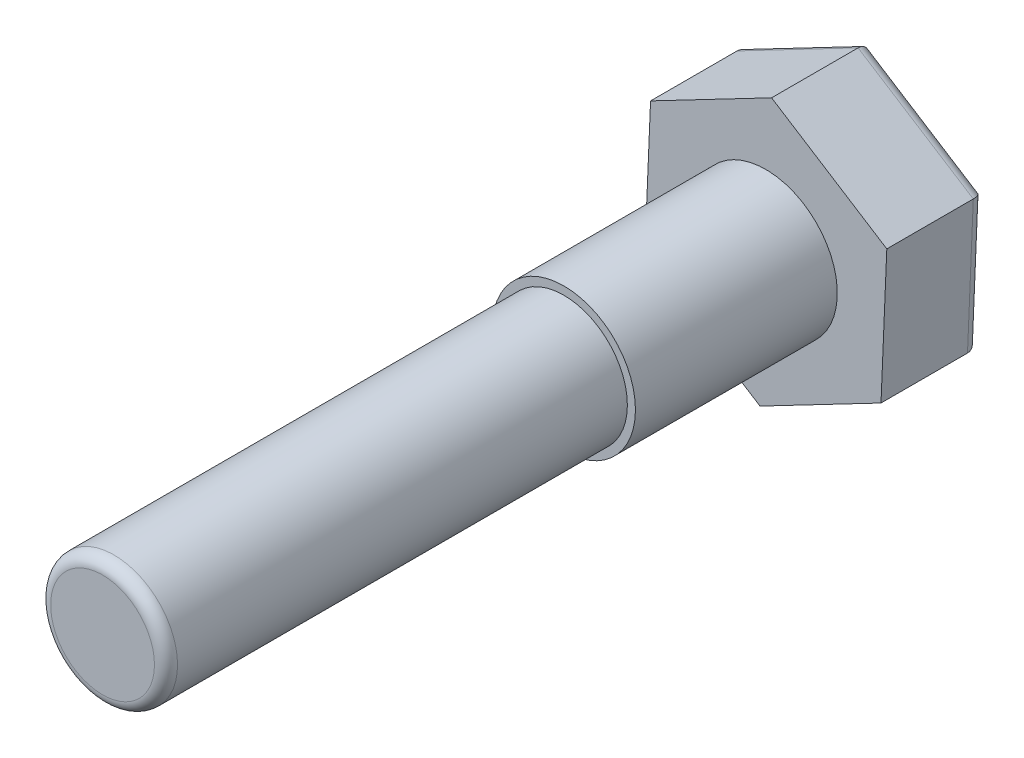
ISO-10303-21;
HEADER;
FILE_DESCRIPTION(('STEP AP214'),'2;1');
FILE_NAME('part.step','',(''),(''),'','','');
FILE_SCHEMA(('AUTOMOTIVE_DESIGN { 1 0 10303 214 1 1 1 1 }'));
ENDSEC;
DATA;
#1=APPLICATION_CONTEXT('core data for automotive mechanical design processes');
#2=APPLICATION_PROTOCOL_DEFINITION('international standard','automotive_design',2000,#1);
#3=PRODUCT_CONTEXT('',#1,'mechanical');
#4=PRODUCT('Part','Part','',(#3));
#5=PRODUCT_RELATED_PRODUCT_CATEGORY('part','',(#4));
#6=PRODUCT_DEFINITION_FORMATION('','',#4);
#7=PRODUCT_DEFINITION_CONTEXT('part definition',#1,'design');
#8=PRODUCT_DEFINITION('design','',#6,#7);
#9=PRODUCT_DEFINITION_SHAPE('','',#8);
#10=(LENGTH_UNIT() NAMED_UNIT(*) SI_UNIT(.MILLI.,.METRE.));
#11=(NAMED_UNIT(*) PLANE_ANGLE_UNIT() SI_UNIT($,.RADIAN.));
#12=(NAMED_UNIT(*) SI_UNIT($,.STERADIAN.) SOLID_ANGLE_UNIT());
#13=UNCERTAINTY_MEASURE_WITH_UNIT(LENGTH_MEASURE(1.E-05),#10,'distance_accuracy_value','');
#14=(GEOMETRIC_REPRESENTATION_CONTEXT(3) GLOBAL_UNCERTAINTY_ASSIGNED_CONTEXT((#13)) GLOBAL_UNIT_ASSIGNED_CONTEXT((#10,
#11,#12)) REPRESENTATION_CONTEXT('',''));
#15=CARTESIAN_POINT('',(0.,0.,0.));
#16=DIRECTION('',(0.,0.,1.));
#17=DIRECTION('',(1.,0.,0.));
#18=AXIS2_PLACEMENT_3D('',#15,#16,#17);
#19=CARTESIAN_POINT('',(0.,0.,52.));
#20=DIRECTION('',(0.,0.,1.));
#21=DIRECTION('',(1.,0.,0.));
#22=AXIS2_PLACEMENT_3D('',#19,#20,#21);
#23=PLANE('',#22);
#24=CARTESIAN_POINT('',(0.,0.,52.));
#25=DIRECTION('',(0.,0.,1.));
#26=DIRECTION('',(1.,0.,0.));
#27=AXIS2_PLACEMENT_3D('',#24,#25,#26);
#28=CIRCLE('',#27,12.4);
#29=CARTESIAN_POINT('',(12.4,0.,52.));
#30=VERTEX_POINT('',#29);
#31=EDGE_CURVE('E128',#30,#30,#28,.T.);
#32=ORIENTED_EDGE('',*,*,#31,.T.);
#33=EDGE_LOOP('',(#32));
#34=FACE_BOUND('',#33,.T.);
#35=CARTESIAN_POINT('',(0.,0.,52.));
#36=DIRECTION('',(0.,0.,1.));
#37=DIRECTION('',(1.,0.,0.));
#38=AXIS2_PLACEMENT_3D('',#35,#36,#37);
#39=CIRCLE('',#38,11.);
#40=CARTESIAN_POINT('',(11.,0.,52.));
#41=VERTEX_POINT('',#40);
#42=EDGE_CURVE('E166',#41,#41,#39,.T.);
#43=ORIENTED_EDGE('',*,*,#42,.F.);
#44=EDGE_LOOP('',(#43));
#45=FACE_BOUND('',#44,.T.);
#46=ADVANCED_FACE('F34',(#34,#45),#23,.T.);
#47=CARTESIAN_POINT('',(18.9733976863162,-36.3457037383633,17.));
#48=DIRECTION('',(0.,0.,-1.));
#49=DIRECTION('',(-1.,0.,0.));
#50=AXIS2_PLACEMENT_3D('',#47,#48,#49);
#51=PLANE('',#50);
#52=DIRECTION('',(0.0424733530909036,0.999097599975706,0.));
#53=VECTOR('',#52,1.);
#54=CARTESIAN_POINT('',(19.9787997617734,-12.6957037383635,17.));
#55=LINE('',#54,#53);
#56=CARTESIAN_POINT('',(19.9787997617734,-12.6957037383635,17.));
#57=VERTEX_POINT('',#56);
#58=CARTESIAN_POINT('',(20.9842018372306,10.9542962616365,17.));
#59=VERTEX_POINT('',#58);
#60=EDGE_CURVE('E120',#57,#59,#55,.T.);
#61=ORIENTED_EDGE('',*,*,#60,.T.);
#62=DIRECTION('',(-0.844007225893572,0.536331802748482,0.));
#63=VECTOR('',#62,1.);
#64=CARTESIAN_POINT('',(20.9842018372306,10.9542962616365,17.));
#65=LINE('',#64,#63);
#66=CARTESIAN_POINT('',(1.0054020754572,23.65,17.));
#67=VERTEX_POINT('',#66);
#68=EDGE_CURVE('E108',#59,#67,#65,.T.);
#69=ORIENTED_EDGE('',*,*,#68,.T.);
#70=DIRECTION('',(-0.886480578984472,-0.462765797227231,0.));
#71=VECTOR('',#70,1.);
#72=CARTESIAN_POINT('',(1.0054020754572,23.65,17.));
#73=LINE('',#72,#71);
#74=CARTESIAN_POINT('',(-19.9787997617736,12.6957037383632,17.));
#75=VERTEX_POINT('',#74);
#76=EDGE_CURVE('E119',#67,#75,#73,.T.);
#77=ORIENTED_EDGE('',*,*,#76,.T.);
#78=DIRECTION('',(-0.0424733530908878,-0.999097599975706,0.));
#79=VECTOR('',#78,1.);
#80=CARTESIAN_POINT('',(-19.9787997617736,12.6957037383632,17.));
#81=LINE('',#80,#79);
#82=CARTESIAN_POINT('',(-20.9842018372304,-10.9542962616368,17.));
#83=VERTEX_POINT('',#82);
#84=EDGE_CURVE('E270',#75,#83,#81,.T.);
#85=ORIENTED_EDGE('',*,*,#84,.T.);
#86=DIRECTION('',(0.844007225893576,-0.536331802748476,0.));
#87=VECTOR('',#86,1.);
#88=CARTESIAN_POINT('',(-20.9842018372304,-10.9542962616368,17.));
#89=LINE('',#88,#87);
#90=CARTESIAN_POINT('',(-1.00540207545719,-23.65,17.));
#91=VERTEX_POINT('',#90);
#92=EDGE_CURVE('E272',#83,#91,#89,.T.);
#93=ORIENTED_EDGE('',*,*,#92,.T.);
#94=DIRECTION('',(0.886480578984476,0.462765797227224,0.));
#95=VECTOR('',#94,1.);
#96=CARTESIAN_POINT('',(-1.00540207545719,-23.65,17.));
#97=LINE('',#96,#95);
#98=EDGE_CURVE('E126',#91,#57,#97,.T.);
#99=ORIENTED_EDGE('',*,*,#98,.T.);
#100=EDGE_LOOP('',(#61,#69,#77,#85,#93,#99));
#101=FACE_BOUND('',#100,.T.);
#102=CARTESIAN_POINT('',(0.,0.,17.));
#103=DIRECTION('',(0.,0.,-1.));
#104=DIRECTION('',(-1.,0.,0.));
#105=AXIS2_PLACEMENT_3D('',#102,#103,#104);
#106=CIRCLE('',#105,12.4);
#107=CARTESIAN_POINT('',(-12.4,0.,17.));
#108=VERTEX_POINT('',#107);
#109=EDGE_CURVE('E133',#108,#108,#106,.F.);
#110=ORIENTED_EDGE('',*,*,#109,.F.);
#111=EDGE_LOOP('',(#110));
#112=FACE_BOUND('',#111,.T.);
#113=ADVANCED_FACE('F123',(#101,#112),#51,.F.);
#114=CARTESIAN_POINT('',(19.9787997617734,-12.6957037383635,17.));
#115=DIRECTION('',(-0.999097599975706,0.0424733530909036,0.));
#116=DIRECTION('',(-0.0424733530909036,-0.999097599975706,0.));
#117=AXIS2_PLACEMENT_3D('',#114,#115,#116);
#118=PLANE('',#117);
#119=DIRECTION('',(0.,0.,-1.));
#120=VECTOR('',#119,1.);
#121=CARTESIAN_POINT('',(19.9787997617734,-12.6957037383635,17.));
#122=LINE('',#121,#120);
#123=CARTESIAN_POINT('',(19.9787997617734,-12.6957037383635,2.));
#124=VERTEX_POINT('',#123);
#125=EDGE_CURVE('E277',#57,#124,#122,.T.);
#126=ORIENTED_EDGE('',*,*,#125,.T.);
#127=DIRECTION('',(0.0424733530909036,0.999097599975706,0.));
#128=VECTOR('',#127,1.);
#129=CARTESIAN_POINT('',(20.9842018372306,10.9542962616365,2.));
#130=LINE('',#129,#128);
#131=CARTESIAN_POINT('',(20.9842018372306,10.9542962616365,2.));
#132=VERTEX_POINT('',#131);
#133=EDGE_CURVE('E132',#124,#132,#130,.T.);
#134=ORIENTED_EDGE('',*,*,#133,.T.);
#135=DIRECTION('',(0.,0.,-1.));
#136=VECTOR('',#135,1.);
#137=CARTESIAN_POINT('',(20.9842018372306,10.9542962616365,17.));
#138=LINE('',#137,#136);
#139=EDGE_CURVE('E113',#59,#132,#138,.T.);
#140=ORIENTED_EDGE('',*,*,#139,.F.);
#141=ORIENTED_EDGE('',*,*,#60,.F.);
#142=EDGE_LOOP('',(#126,#134,#140,#141));
#143=FACE_BOUND('',#142,.T.);
#144=ADVANCED_FACE('F130',(#143),#118,.F.);
#145=CARTESIAN_POINT('',(20.9842018372306,10.9542962616365,17.));
#146=DIRECTION('',(-0.536331802748482,-0.844007225893572,0.));
#147=DIRECTION('',(0.844007225893572,-0.536331802748482,0.));
#148=AXIS2_PLACEMENT_3D('',#145,#146,#147);
#149=PLANE('',#148);
#150=ORIENTED_EDGE('',*,*,#139,.T.);
#151=DIRECTION('',(-0.844007225893572,0.536331802748482,0.));
#152=VECTOR('',#151,1.);
#153=CARTESIAN_POINT('',(1.00540207545719,23.65,2.));
#154=LINE('',#153,#152);
#155=CARTESIAN_POINT('',(1.0054020754572,23.65,2.));
#156=VERTEX_POINT('',#155);
#157=EDGE_CURVE('E136',#132,#156,#154,.T.);
#158=ORIENTED_EDGE('',*,*,#157,.T.);
#159=DIRECTION('',(0.,0.,-1.));
#160=VECTOR('',#159,1.);
#161=CARTESIAN_POINT('',(1.0054020754572,23.65,17.));
#162=LINE('',#161,#160);
#163=EDGE_CURVE('E116',#67,#156,#162,.T.);
#164=ORIENTED_EDGE('',*,*,#163,.F.);
#165=ORIENTED_EDGE('',*,*,#68,.F.);
#166=EDGE_LOOP('',(#150,#158,#164,#165));
#167=FACE_BOUND('',#166,.T.);
#168=ADVANCED_FACE('F110',(#167),#149,.F.);
#169=CARTESIAN_POINT('',(1.0054020754572,23.65,17.));
#170=DIRECTION('',(0.462765797227231,-0.886480578984472,0.));
#171=DIRECTION('',(0.886480578984472,0.462765797227231,0.));
#172=AXIS2_PLACEMENT_3D('',#169,#170,#171);
#173=PLANE('',#172);
#174=ORIENTED_EDGE('',*,*,#163,.T.);
#175=DIRECTION('',(-0.886480578984472,-0.462765797227231,0.));
#176=VECTOR('',#175,1.);
#177=CARTESIAN_POINT('',(-19.9787997617736,12.6957037383632,2.));
#178=LINE('',#177,#176);
#179=CARTESIAN_POINT('',(-19.9787997617736,12.6957037383632,2.));
#180=VERTEX_POINT('',#179);
#181=EDGE_CURVE('E156',#156,#180,#178,.T.);
#182=ORIENTED_EDGE('',*,*,#181,.T.);
#183=DIRECTION('',(0.,0.,-1.));
#184=VECTOR('',#183,1.);
#185=CARTESIAN_POINT('',(-19.9787997617736,12.6957037383632,17.));
#186=LINE('',#185,#184);
#187=EDGE_CURVE('E138',#75,#180,#186,.T.);
#188=ORIENTED_EDGE('',*,*,#187,.F.);
#189=ORIENTED_EDGE('',*,*,#76,.F.);
#190=EDGE_LOOP('',(#174,#182,#188,#189));
#191=FACE_BOUND('',#190,.T.);
#192=ADVANCED_FACE('F221',(#191),#173,.F.);
#193=CARTESIAN_POINT('',(-19.9787997617736,12.6957037383632,17.));
#194=DIRECTION('',(0.999097599975706,-0.0424733530908878,0.));
#195=DIRECTION('',(0.0424733530908878,0.999097599975707,0.));
#196=AXIS2_PLACEMENT_3D('',#193,#194,#195);
#197=PLANE('',#196);
#198=ORIENTED_EDGE('',*,*,#187,.T.);
#199=DIRECTION('',(-0.0424733530908878,-0.999097599975707,0.));
#200=VECTOR('',#199,1.);
#201=CARTESIAN_POINT('',(-20.9842018372304,-10.9542962616368,2.));
#202=LINE('',#201,#200);
#203=CARTESIAN_POINT('',(-20.9842018372304,-10.9542962616368,2.));
#204=VERTEX_POINT('',#203);
#205=EDGE_CURVE('E158',#180,#204,#202,.T.);
#206=ORIENTED_EDGE('',*,*,#205,.T.);
#207=DIRECTION('',(0.,0.,-1.));
#208=VECTOR('',#207,1.);
#209=CARTESIAN_POINT('',(-20.9842018372304,-10.9542962616368,17.));
#210=LINE('',#209,#208);
#211=EDGE_CURVE('E281',#83,#204,#210,.T.);
#212=ORIENTED_EDGE('',*,*,#211,.F.);
#213=ORIENTED_EDGE('',*,*,#84,.F.);
#214=EDGE_LOOP('',(#198,#206,#212,#213));
#215=FACE_BOUND('',#214,.T.);
#216=ADVANCED_FACE('F218',(#215),#197,.F.);
#217=CARTESIAN_POINT('',(-20.9842018372304,-10.9542962616368,17.));
#218=DIRECTION('',(0.536331802748476,0.844007225893576,0.));
#219=DIRECTION('',(-0.844007225893576,0.536331802748476,0.));
#220=AXIS2_PLACEMENT_3D('',#217,#218,#219);
#221=PLANE('',#220);
#222=ORIENTED_EDGE('',*,*,#211,.T.);
#223=DIRECTION('',(0.844007225893576,-0.536331802748476,0.));
#224=VECTOR('',#223,1.);
#225=CARTESIAN_POINT('',(-1.00540207545719,-23.65,2.));
#226=LINE('',#225,#224);
#227=CARTESIAN_POINT('',(-1.00540207545719,-23.65,2.));
#228=VERTEX_POINT('',#227);
#229=EDGE_CURVE('E57',#204,#228,#226,.T.);
#230=ORIENTED_EDGE('',*,*,#229,.T.);
#231=DIRECTION('',(0.,0.,-1.));
#232=VECTOR('',#231,1.);
#233=CARTESIAN_POINT('',(-1.00540207545719,-23.65,17.));
#234=LINE('',#233,#232);
#235=EDGE_CURVE('E279',#91,#228,#234,.T.);
#236=ORIENTED_EDGE('',*,*,#235,.F.);
#237=ORIENTED_EDGE('',*,*,#92,.F.);
#238=EDGE_LOOP('',(#222,#230,#236,#237));
#239=FACE_BOUND('',#238,.T.);
#240=ADVANCED_FACE('F215',(#239),#221,.F.);
#241=CARTESIAN_POINT('',(-1.00540207545719,-23.65,17.));
#242=DIRECTION('',(-0.462765797227224,0.886480578984476,0.));
#243=DIRECTION('',(-0.886480578984476,-0.462765797227224,0.));
#244=AXIS2_PLACEMENT_3D('',#241,#242,#243);
#245=PLANE('',#244);
#246=ORIENTED_EDGE('',*,*,#235,.T.);
#247=DIRECTION('',(0.886480578984476,0.462765797227224,0.));
#248=VECTOR('',#247,1.);
#249=CARTESIAN_POINT('',(19.9787997617734,-12.6957037383635,2.));
#250=LINE('',#249,#248);
#251=EDGE_CURVE('E49',#228,#124,#250,.T.);
#252=ORIENTED_EDGE('',*,*,#251,.T.);
#253=ORIENTED_EDGE('',*,*,#125,.F.);
#254=ORIENTED_EDGE('',*,*,#98,.F.);
#255=EDGE_LOOP('',(#246,#252,#253,#254));
#256=FACE_BOUND('',#255,.T.);
#257=ADVANCED_FACE('F211',(#256),#245,.F.);
#258=CARTESIAN_POINT('',(18.9733976863162,-36.3457037383633,0.));
#259=DIRECTION('',(0.,0.,-1.));
#260=DIRECTION('',(-1.,0.,0.));
#261=AXIS2_PLACEMENT_3D('',#258,#259,#260);
#262=PLANE('',#261);
#263=DIRECTION('',(-0.886480578984472,-0.462765797227231,0.));
#264=VECTOR('',#263,1.);
#265=CARTESIAN_POINT('',(1.93093366991166,21.8770388420311,0.));
#266=LINE('',#265,#264);
#267=CARTESIAN_POINT('',(-18.029648565503,11.4570984955961,0.));
#268=VERTEX_POINT('',#267);
#269=CARTESIAN_POINT('',(0.907314068095531,21.3426829268293,0.));
#270=VERTEX_POINT('',#269);
#271=EDGE_CURVE('E151',#268,#270,#266,.F.);
#272=ORIENTED_EDGE('',*,*,#271,.T.);
#273=DIRECTION('',(-0.844007225893572,0.536331802748482,0.));
#274=VECTOR('',#273,1.);
#275=CARTESIAN_POINT('',(19.9115382317336,9.26628180984933,0.));
#276=LINE('',#275,#274);
#277=CARTESIAN_POINT('',(18.9369626335983,9.88558443123292,0.));
#278=VERTEX_POINT('',#277);
#279=EDGE_CURVE('E153',#270,#278,#276,.F.);
#280=ORIENTED_EDGE('',*,*,#279,.T.);
#281=DIRECTION('',(0.0424733530909036,0.999097599975706,0.));
#282=VECTOR('',#281,1.);
#283=CARTESIAN_POINT('',(17.980604561822,-12.6107570321817,0.));
#284=LINE('',#283,#282);
#285=CARTESIAN_POINT('',(18.0296485655028,-11.4570984955964,0.));
#286=VERTEX_POINT('',#285);
#287=EDGE_CURVE('E143',#278,#286,#284,.F.);
#288=ORIENTED_EDGE('',*,*,#287,.T.);
#289=DIRECTION('',(0.886480578984476,0.462765797227224,0.));
#290=VECTOR('',#289,1.);
#291=CARTESIAN_POINT('',(-1.93093366991164,-21.877038842031,0.));
#292=LINE('',#291,#290);
#293=CARTESIAN_POINT('',(-0.90731406809552,-21.3426829268293,0.));
#294=VERTEX_POINT('',#293);
#295=EDGE_CURVE('E145',#286,#294,#292,.F.);
#296=ORIENTED_EDGE('',*,*,#295,.T.);
#297=DIRECTION('',(0.844007225893576,-0.536331802748476,0.));
#298=VECTOR('',#297,1.);
#299=CARTESIAN_POINT('',(-19.9115382317334,-9.26628180984964,0.));
#300=LINE('',#299,#298);
#301=CARTESIAN_POINT('',(-18.9369626335981,-9.88558443123322,0.));
#302=VERTEX_POINT('',#301);
#303=EDGE_CURVE('E147',#294,#302,#300,.F.);
#304=ORIENTED_EDGE('',*,*,#303,.T.);
#305=DIRECTION('',(-0.0424733530908878,-0.999097599975707,0.));
#306=VECTOR('',#305,1.);
#307=CARTESIAN_POINT('',(-17.9806045618221,12.6107570321814,0.));
#308=LINE('',#307,#306);
#309=EDGE_CURVE('E149',#302,#268,#308,.F.);
#310=ORIENTED_EDGE('',*,*,#309,.T.);
#311=EDGE_LOOP('',(#272,#280,#288,#296,#304,#310));
#312=FACE_BOUND('',#311,.T.);
#313=ADVANCED_FACE('F206',(#312),#262,.T.);
#314=CARTESIAN_POINT('',(0.,0.,52.));
#315=DIRECTION('',(0.,0.,-1.));
#316=DIRECTION('',(-1.,0.,0.));
#317=AXIS2_PLACEMENT_3D('',#314,#315,#316);
#318=CYLINDRICAL_SURFACE('',#317,12.4);
#319=ORIENTED_EDGE('',*,*,#31,.F.);
#320=EDGE_LOOP('',(#319));
#321=FACE_BOUND('',#320,.T.);
#322=ORIENTED_EDGE('',*,*,#109,.T.);
#323=EDGE_LOOP('',(#322));
#324=FACE_BOUND('',#323,.T.);
#325=ADVANCED_FACE('F203',(#321,#324),#318,.T.);
#326=CARTESIAN_POINT('',(-19.9115382317334,-9.26628180984964,2.));
#327=DIRECTION('',(-0.844007225893576,0.536331802748476,0.));
#328=DIRECTION('',(-0.536331802748476,-0.844007225893576,0.));
#329=AXIS2_PLACEMENT_3D('',#326,#327,#328);
#330=CYLINDRICAL_SURFACE('',#329,2.);
#331=CARTESIAN_POINT('',(-18.9369626335981,-9.88558443123322,2.));
#332=DIRECTION('',(-0.462765797227234,0.886480578984471,0.));
#333=DIRECTION('',(-0.886480578984471,-0.462765797227234,0.));
#334=AXIS2_PLACEMENT_3D('',#331,#332,#333);
#335=ELLIPSE('',#334,2.3094010767585,2.);
#336=EDGE_CURVE('E174',#302,#204,#335,.T.);
#337=ORIENTED_EDGE('',*,*,#336,.F.);
#338=ORIENTED_EDGE('',*,*,#303,.F.);
#339=CARTESIAN_POINT('',(-0.90731406809552,-21.3426829268293,2.));
#340=DIRECTION('',(-0.999097599975706,0.0424733530909003,0.));
#341=DIRECTION('',(-0.0424733530909002,-0.999097599975706,0.));
#342=AXIS2_PLACEMENT_3D('',#339,#340,#341);
#343=ELLIPSE('',#342,2.3094010767585,2.);
#344=EDGE_CURVE('E177',#228,#294,#343,.F.);
#345=ORIENTED_EDGE('',*,*,#344,.F.);
#346=ORIENTED_EDGE('',*,*,#229,.F.);
#347=EDGE_LOOP('',(#337,#338,#345,#346));
#348=FACE_BOUND('',#347,.T.);
#349=ADVANCED_FACE('F205',(#348),#330,.T.);
#350=CARTESIAN_POINT('',(-1.93093366991164,-21.877038842031,2.));
#351=DIRECTION('',(-0.886480578984476,-0.462765797227224,0.));
#352=DIRECTION('',(0.462765797227224,-0.886480578984476,0.));
#353=AXIS2_PLACEMENT_3D('',#350,#351,#352);
#354=CYLINDRICAL_SURFACE('',#353,2.);
#355=ORIENTED_EDGE('',*,*,#344,.T.);
#356=ORIENTED_EDGE('',*,*,#295,.F.);
#357=CARTESIAN_POINT('',(18.0296485655028,-11.4570984955964,2.));
#358=DIRECTION('',(-0.536331802748482,-0.844007225893572,0.));
#359=DIRECTION('',(0.844007225893572,-0.536331802748482,0.));
#360=AXIS2_PLACEMENT_3D('',#357,#358,#359);
#361=ELLIPSE('',#360,2.3094010767585,2.);
#362=EDGE_CURVE('E171',#124,#286,#361,.F.);
#363=ORIENTED_EDGE('',*,*,#362,.F.);
#364=ORIENTED_EDGE('',*,*,#251,.F.);
#365=EDGE_LOOP('',(#355,#356,#363,#364));
#366=FACE_BOUND('',#365,.T.);
#367=ADVANCED_FACE('F245',(#366),#354,.T.);
#368=CARTESIAN_POINT('',(-17.9806045618221,12.6107570321814,2.));
#369=DIRECTION('',(0.0424733530908878,0.999097599975707,0.));
#370=DIRECTION('',(-0.999097599975707,0.0424733530908878,0.));
#371=AXIS2_PLACEMENT_3D('',#368,#369,#370);
#372=CYLINDRICAL_SURFACE('',#371,2.);
#373=ORIENTED_EDGE('',*,*,#336,.T.);
#374=ORIENTED_EDGE('',*,*,#205,.F.);
#375=CARTESIAN_POINT('',(-18.029648565503,11.457098495596,2.));
#376=DIRECTION('',(0.536331802748472,0.844007225893579,0.));
#377=DIRECTION('',(-0.844007225893579,0.536331802748472,0.));
#378=AXIS2_PLACEMENT_3D('',#375,#376,#377);
#379=ELLIPSE('',#378,2.30940107675851,2.);
#380=EDGE_CURVE('E168',#268,#180,#379,.T.);
#381=ORIENTED_EDGE('',*,*,#380,.F.);
#382=ORIENTED_EDGE('',*,*,#309,.F.);
#383=EDGE_LOOP('',(#373,#374,#381,#382));
#384=FACE_BOUND('',#383,.T.);
#385=ADVANCED_FACE('F241',(#384),#372,.T.);
#386=CARTESIAN_POINT('',(17.980604561822,-12.6107570321817,2.));
#387=DIRECTION('',(-0.0424733530909036,-0.999097599975706,0.));
#388=DIRECTION('',(0.999097599975706,-0.0424733530909036,0.));
#389=AXIS2_PLACEMENT_3D('',#386,#387,#388);
#390=CYLINDRICAL_SURFACE('',#389,2.);
#391=ORIENTED_EDGE('',*,*,#362,.T.);
#392=ORIENTED_EDGE('',*,*,#287,.F.);
#393=CARTESIAN_POINT('',(18.9369626335983,9.88558443123291,2.));
#394=DIRECTION('',(0.462765797227224,-0.886480578984476,0.));
#395=DIRECTION('',(-0.886480578984476,-0.462765797227224,0.));
#396=AXIS2_PLACEMENT_3D('',#393,#394,#395);
#397=ELLIPSE('',#396,2.3094010767585,2.);
#398=EDGE_CURVE('E165',#132,#278,#397,.F.);
#399=ORIENTED_EDGE('',*,*,#398,.F.);
#400=ORIENTED_EDGE('',*,*,#133,.F.);
#401=EDGE_LOOP('',(#391,#392,#399,#400));
#402=FACE_BOUND('',#401,.T.);
#403=ADVANCED_FACE('F237',(#402),#390,.T.);
#404=CARTESIAN_POINT('',(1.93093366991166,21.8770388420311,2.));
#405=DIRECTION('',(0.886480578984472,0.462765797227231,0.));
#406=DIRECTION('',(-0.462765797227231,0.886480578984472,0.));
#407=AXIS2_PLACEMENT_3D('',#404,#405,#406);
#408=CYLINDRICAL_SURFACE('',#407,2.);
#409=ORIENTED_EDGE('',*,*,#380,.T.);
#410=ORIENTED_EDGE('',*,*,#181,.F.);
#411=CARTESIAN_POINT('',(0.907314068095525,21.3426829268293,2.));
#412=DIRECTION('',(0.999097599975706,-0.0424733530908997,0.));
#413=DIRECTION('',(0.0424733530908995,0.999097599975706,0.));
#414=AXIS2_PLACEMENT_3D('',#411,#412,#413);
#415=ELLIPSE('',#414,2.30940107675851,2.);
#416=EDGE_CURVE('E163',#270,#156,#415,.T.);
#417=ORIENTED_EDGE('',*,*,#416,.F.);
#418=ORIENTED_EDGE('',*,*,#271,.F.);
#419=EDGE_LOOP('',(#409,#410,#417,#418));
#420=FACE_BOUND('',#419,.T.);
#421=ADVANCED_FACE('F233',(#420),#408,.T.);
#422=CARTESIAN_POINT('',(19.9115382317336,9.26628180984933,2.));
#423=DIRECTION('',(0.844007225893572,-0.536331802748482,0.));
#424=DIRECTION('',(0.536331802748482,0.844007225893572,0.));
#425=AXIS2_PLACEMENT_3D('',#422,#423,#424);
#426=CYLINDRICAL_SURFACE('',#425,2.);
#427=ORIENTED_EDGE('',*,*,#398,.T.);
#428=ORIENTED_EDGE('',*,*,#279,.F.);
#429=ORIENTED_EDGE('',*,*,#416,.T.);
#430=ORIENTED_EDGE('',*,*,#157,.F.);
#431=EDGE_LOOP('',(#427,#428,#429,#430));
#432=FACE_BOUND('',#431,.T.);
#433=ADVANCED_FACE('F230',(#432),#426,.T.);
#434=CARTESIAN_POINT('',(0.,0.,132.));
#435=DIRECTION('',(0.,0.,-1.));
#436=DIRECTION('',(-1.,0.,0.));
#437=AXIS2_PLACEMENT_3D('',#434,#435,#436);
#438=CYLINDRICAL_SURFACE('',#437,11.);
#439=CARTESIAN_POINT('',(0.,0.,130.));
#440=DIRECTION('',(0.,0.,1.));
#441=DIRECTION('',(1.,0.,0.));
#442=AXIS2_PLACEMENT_3D('',#439,#440,#441);
#443=CIRCLE('',#442,11.);
#444=CARTESIAN_POINT('',(11.,0.,130.));
#445=VERTEX_POINT('',#444);
#446=EDGE_CURVE('E11',#445,#445,#443,.F.);
#447=ORIENTED_EDGE('',*,*,#446,.T.);
#448=EDGE_LOOP('',(#447));
#449=FACE_BOUND('',#448,.T.);
#450=ORIENTED_EDGE('',*,*,#42,.T.);
#451=EDGE_LOOP('',(#450));
#452=FACE_BOUND('',#451,.T.);
#453=ADVANCED_FACE('F189',(#449,#452),#438,.T.);
#454=CARTESIAN_POINT('',(0.,0.,132.));
#455=DIRECTION('',(0.,0.,1.));
#456=DIRECTION('',(1.,0.,0.));
#457=AXIS2_PLACEMENT_3D('',#454,#455,#456);
#458=PLANE('',#457);
#459=CARTESIAN_POINT('',(0.,0.,132.));
#460=DIRECTION('',(0.,0.,1.));
#461=DIRECTION('',(1.,0.,0.));
#462=AXIS2_PLACEMENT_3D('',#459,#460,#461);
#463=CIRCLE('',#462,9.);
#464=CARTESIAN_POINT('',(9.,0.,132.));
#465=VERTEX_POINT('',#464);
#466=EDGE_CURVE('E42',#465,#465,#463,.T.);
#467=ORIENTED_EDGE('',*,*,#466,.T.);
#468=EDGE_LOOP('',(#467));
#469=FACE_BOUND('',#468,.T.);
#470=ADVANCED_FACE('F182',(#469),#458,.T.);
#471=CARTESIAN_POINT('',(0.,0.,130.));
#472=DIRECTION('',(0.,0.,1.));
#473=DIRECTION('',(1.,0.,0.));
#474=AXIS2_PLACEMENT_3D('',#471,#472,#473);
#475=TOROIDAL_SURFACE('',#474,9.,2.);
#476=ORIENTED_EDGE('',*,*,#446,.F.);
#477=EDGE_LOOP('',(#476));
#478=FACE_BOUND('',#477,.T.);
#479=ORIENTED_EDGE('',*,*,#466,.F.);
#480=EDGE_LOOP('',(#479));
#481=FACE_BOUND('',#480,.T.);
#482=ADVANCED_FACE('F36',(#478,#481),#475,.T.);
#483=CLOSED_SHELL('',(#46,#113,#144,#168,#192,#216,#240,#257,#313,#325,#349,#367,#385,#403,#421,
#433,#453,#470,#482));
#484=MANIFOLD_SOLID_BREP('B2',#483);
#485=ADVANCED_BREP_SHAPE_REPRESENTATION('',(#18,#484),#14);
#486=SHAPE_DEFINITION_REPRESENTATION(#9,#485);
ENDSEC;
END-ISO-10303-21;
